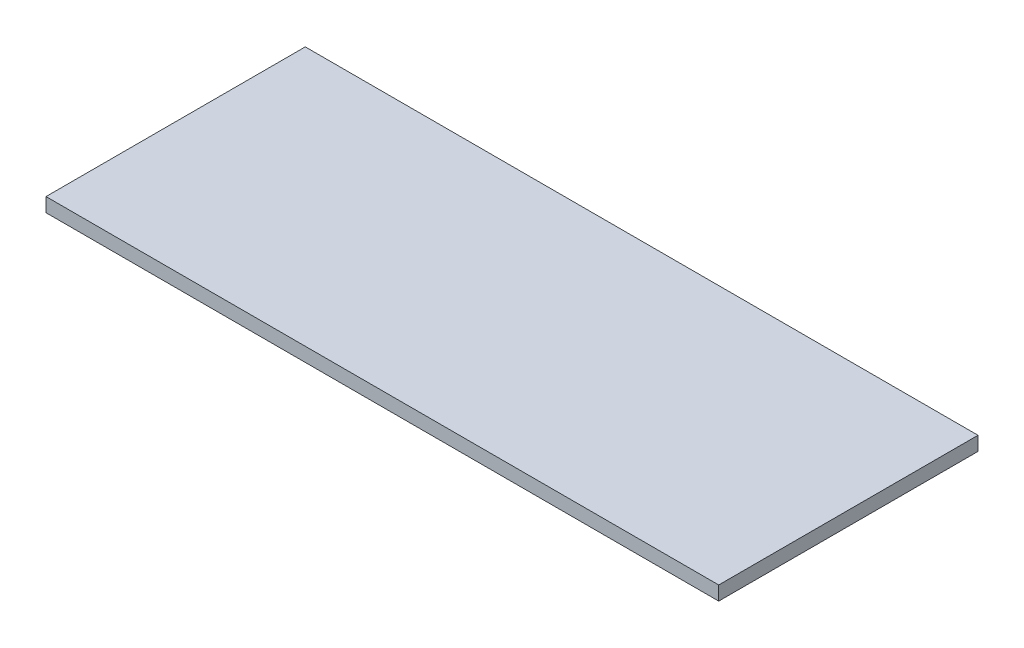
ISO-10303-21;
HEADER;
FILE_DESCRIPTION(('STEP AP214'),'2;1');
FILE_NAME('part.step','',(''),(''),'','','');
FILE_SCHEMA(('AUTOMOTIVE_DESIGN { 1 0 10303 214 1 1 1 1 }'));
ENDSEC;
DATA;
#1=APPLICATION_CONTEXT('core data for automotive mechanical design processes');
#2=APPLICATION_PROTOCOL_DEFINITION('international standard','automotive_design',2000,#1);
#3=PRODUCT_CONTEXT('',#1,'mechanical');
#4=PRODUCT('Part','Part','',(#3));
#5=PRODUCT_RELATED_PRODUCT_CATEGORY('part','',(#4));
#6=PRODUCT_DEFINITION_FORMATION('','',#4);
#7=PRODUCT_DEFINITION_CONTEXT('part definition',#1,'design');
#8=PRODUCT_DEFINITION('design','',#6,#7);
#9=PRODUCT_DEFINITION_SHAPE('','',#8);
#10=(LENGTH_UNIT() NAMED_UNIT(*) SI_UNIT(.MILLI.,.METRE.));
#11=(NAMED_UNIT(*) PLANE_ANGLE_UNIT() SI_UNIT($,.RADIAN.));
#12=(NAMED_UNIT(*) SI_UNIT($,.STERADIAN.) SOLID_ANGLE_UNIT());
#13=UNCERTAINTY_MEASURE_WITH_UNIT(LENGTH_MEASURE(1.E-05),#10,'distance_accuracy_value','');
#14=(GEOMETRIC_REPRESENTATION_CONTEXT(3) GLOBAL_UNCERTAINTY_ASSIGNED_CONTEXT((#13)) GLOBAL_UNIT_ASSIGNED_CONTEXT((#10,
#11,#12)) REPRESENTATION_CONTEXT('',''));
#15=CARTESIAN_POINT('',(0.,0.,0.));
#16=DIRECTION('',(0.,0.,1.));
#17=DIRECTION('',(1.,0.,0.));
#18=AXIS2_PLACEMENT_3D('',#15,#16,#17);
#19=CARTESIAN_POINT('',(304.8,12.7,234.95));
#20=DIRECTION('',(-1.,0.,0.));
#21=DIRECTION('',(0.,0.,1.));
#22=AXIS2_PLACEMENT_3D('',#19,#20,#21);
#23=PLANE('',#22);
#24=DIRECTION('',(0.,0.,-1.));
#25=VECTOR('',#24,1.);
#26=CARTESIAN_POINT('',(304.8,0.,234.95));
#27=LINE('',#26,#25);
#28=CARTESIAN_POINT('',(304.8,0.,234.95));
#29=VERTEX_POINT('',#28);
#30=CARTESIAN_POINT('',(304.8,0.,0.));
#31=VERTEX_POINT('',#30);
#32=EDGE_CURVE('E96',#29,#31,#27,.T.);
#33=ORIENTED_EDGE('',*,*,#32,.T.);
#34=DIRECTION('',(0.,-1.,0.));
#35=VECTOR('',#34,1.);
#36=CARTESIAN_POINT('',(304.8,12.7,0.));
#37=LINE('',#36,#35);
#38=CARTESIAN_POINT('',(304.8,12.7,0.));
#39=VERTEX_POINT('',#38);
#40=EDGE_CURVE('E11',#39,#31,#37,.T.);
#41=ORIENTED_EDGE('',*,*,#40,.F.);
#42=DIRECTION('',(0.,0.,-1.));
#43=VECTOR('',#42,1.);
#44=CARTESIAN_POINT('',(304.8,12.7,234.95));
#45=LINE('',#44,#43);
#46=CARTESIAN_POINT('',(304.8,12.7,234.95));
#47=VERTEX_POINT('',#46);
#48=EDGE_CURVE('E84',#47,#39,#45,.T.);
#49=ORIENTED_EDGE('',*,*,#48,.F.);
#50=DIRECTION('',(0.,-1.,0.));
#51=VECTOR('',#50,1.);
#52=CARTESIAN_POINT('',(304.8,12.7,234.95));
#53=LINE('',#52,#51);
#54=EDGE_CURVE('E92',#47,#29,#53,.T.);
#55=ORIENTED_EDGE('',*,*,#54,.T.);
#56=EDGE_LOOP('',(#33,#41,#49,#55));
#57=FACE_BOUND('',#56,.T.);
#58=ADVANCED_FACE('F33',(#57),#23,.F.);
#59=CARTESIAN_POINT('',(-304.8,12.7,0.));
#60=DIRECTION('',(0.,0.,1.));
#61=DIRECTION('',(1.,0.,0.));
#62=AXIS2_PLACEMENT_3D('',#59,#60,#61);
#63=PLANE('',#62);
#64=DIRECTION('',(-1.,0.,0.));
#65=VECTOR('',#64,1.);
#66=CARTESIAN_POINT('',(-304.8,0.,0.));
#67=LINE('',#66,#65);
#68=CARTESIAN_POINT('',(-304.8,0.,0.));
#69=VERTEX_POINT('',#68);
#70=EDGE_CURVE('E88',#31,#69,#67,.T.);
#71=ORIENTED_EDGE('',*,*,#70,.T.);
#72=DIRECTION('',(0.,-1.,0.));
#73=VECTOR('',#72,1.);
#74=CARTESIAN_POINT('',(-304.8,12.7,0.));
#75=LINE('',#74,#73);
#76=CARTESIAN_POINT('',(-304.8,12.7,0.));
#77=VERTEX_POINT('',#76);
#78=EDGE_CURVE('E41',#77,#69,#75,.T.);
#79=ORIENTED_EDGE('',*,*,#78,.F.);
#80=DIRECTION('',(-1.,0.,0.));
#81=VECTOR('',#80,1.);
#82=CARTESIAN_POINT('',(-304.8,12.7,0.));
#83=LINE('',#82,#81);
#84=EDGE_CURVE('E79',#39,#77,#83,.T.);
#85=ORIENTED_EDGE('',*,*,#84,.F.);
#86=ORIENTED_EDGE('',*,*,#40,.T.);
#87=EDGE_LOOP('',(#71,#79,#85,#86));
#88=FACE_BOUND('',#87,.T.);
#89=ADVANCED_FACE('F87',(#88),#63,.F.);
#90=CARTESIAN_POINT('',(-304.8,12.7,234.95));
#91=DIRECTION('',(1.,0.,0.));
#92=DIRECTION('',(0.,0.,-1.));
#93=AXIS2_PLACEMENT_3D('',#90,#91,#92);
#94=PLANE('',#93);
#95=DIRECTION('',(0.,0.,1.));
#96=VECTOR('',#95,1.);
#97=CARTESIAN_POINT('',(-304.8,0.,234.95));
#98=LINE('',#97,#96);
#99=CARTESIAN_POINT('',(-304.8,0.,234.95));
#100=VERTEX_POINT('',#99);
#101=EDGE_CURVE('E66',#69,#100,#98,.T.);
#102=ORIENTED_EDGE('',*,*,#101,.T.);
#103=DIRECTION('',(0.,-1.,0.));
#104=VECTOR('',#103,1.);
#105=CARTESIAN_POINT('',(-304.8,12.7,234.95));
#106=LINE('',#105,#104);
#107=CARTESIAN_POINT('',(-304.8,12.7,234.95));
#108=VERTEX_POINT('',#107);
#109=EDGE_CURVE('E89',#108,#100,#106,.T.);
#110=ORIENTED_EDGE('',*,*,#109,.F.);
#111=DIRECTION('',(0.,0.,1.));
#112=VECTOR('',#111,1.);
#113=CARTESIAN_POINT('',(-304.8,12.7,234.95));
#114=LINE('',#113,#112);
#115=EDGE_CURVE('E82',#77,#108,#114,.T.);
#116=ORIENTED_EDGE('',*,*,#115,.F.);
#117=ORIENTED_EDGE('',*,*,#78,.T.);
#118=EDGE_LOOP('',(#102,#110,#116,#117));
#119=FACE_BOUND('',#118,.T.);
#120=ADVANCED_FACE('F90',(#119),#94,.F.);
#121=CARTESIAN_POINT('',(-304.8,12.7,234.95));
#122=DIRECTION('',(0.,0.,-1.));
#123=DIRECTION('',(-1.,0.,0.));
#124=AXIS2_PLACEMENT_3D('',#121,#122,#123);
#125=PLANE('',#124);
#126=DIRECTION('',(1.,0.,0.));
#127=VECTOR('',#126,1.);
#128=CARTESIAN_POINT('',(-304.8,0.,234.95));
#129=LINE('',#128,#127);
#130=EDGE_CURVE('E72',#100,#29,#129,.T.);
#131=ORIENTED_EDGE('',*,*,#130,.T.);
#132=ORIENTED_EDGE('',*,*,#54,.F.);
#133=DIRECTION('',(1.,0.,0.));
#134=VECTOR('',#133,1.);
#135=CARTESIAN_POINT('',(-304.8,12.7,234.95));
#136=LINE('',#135,#134);
#137=EDGE_CURVE('E49',#108,#47,#136,.T.);
#138=ORIENTED_EDGE('',*,*,#137,.F.);
#139=ORIENTED_EDGE('',*,*,#109,.T.);
#140=EDGE_LOOP('',(#131,#132,#138,#139));
#141=FACE_BOUND('',#140,.T.);
#142=ADVANCED_FACE('F103',(#141),#125,.F.);
#143=CARTESIAN_POINT('',(0.,12.7,0.));
#144=DIRECTION('',(0.,-1.,0.));
#145=DIRECTION('',(0.,0.,-1.));
#146=AXIS2_PLACEMENT_3D('',#143,#144,#145);
#147=PLANE('',#146);
#148=ORIENTED_EDGE('',*,*,#48,.T.);
#149=ORIENTED_EDGE('',*,*,#84,.T.);
#150=ORIENTED_EDGE('',*,*,#115,.T.);
#151=ORIENTED_EDGE('',*,*,#137,.T.);
#152=EDGE_LOOP('',(#148,#149,#150,#151));
#153=FACE_BOUND('',#152,.T.);
#154=ADVANCED_FACE('F80',(#153),#147,.F.);
#155=CARTESIAN_POINT('',(0.,0.,0.));
#156=DIRECTION('',(0.,-1.,0.));
#157=DIRECTION('',(0.,0.,-1.));
#158=AXIS2_PLACEMENT_3D('',#155,#156,#157);
#159=PLANE('',#158);
#160=ORIENTED_EDGE('',*,*,#32,.F.);
#161=ORIENTED_EDGE('',*,*,#130,.F.);
#162=ORIENTED_EDGE('',*,*,#101,.F.);
#163=ORIENTED_EDGE('',*,*,#70,.F.);
#164=EDGE_LOOP('',(#160,#161,#162,#163));
#165=FACE_BOUND('',#164,.T.);
#166=ADVANCED_FACE('F106',(#165),#159,.T.);
#167=CLOSED_SHELL('',(#58,#89,#120,#142,#154,#166));
#168=MANIFOLD_SOLID_BREP('B2',#167);
#169=ADVANCED_BREP_SHAPE_REPRESENTATION('',(#18,#168),#14);
#170=SHAPE_DEFINITION_REPRESENTATION(#9,#169);
ENDSEC;
END-ISO-10303-21;
